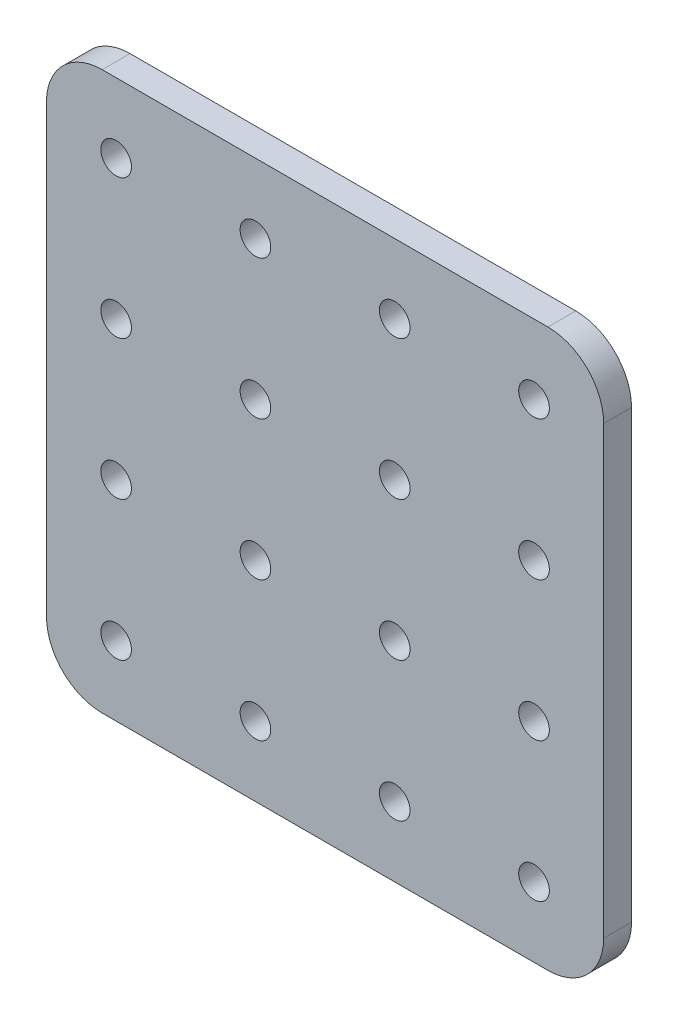
ISO-10303-21;
HEADER;
FILE_DESCRIPTION(('STEP AP214'),'2;1');
FILE_NAME('part.step','',(''),(''),'','','');
FILE_SCHEMA(('AUTOMOTIVE_DESIGN { 1 0 10303 214 1 1 1 1 }'));
ENDSEC;
DATA;
#1=APPLICATION_CONTEXT('core data for automotive mechanical design processes');
#2=APPLICATION_PROTOCOL_DEFINITION('international standard','automotive_design',2000,#1);
#3=PRODUCT_CONTEXT('',#1,'mechanical');
#4=PRODUCT('Part','Part','',(#3));
#5=PRODUCT_RELATED_PRODUCT_CATEGORY('part','',(#4));
#6=PRODUCT_DEFINITION_FORMATION('','',#4);
#7=PRODUCT_DEFINITION_CONTEXT('part definition',#1,'design');
#8=PRODUCT_DEFINITION('design','',#6,#7);
#9=PRODUCT_DEFINITION_SHAPE('','',#8);
#10=(LENGTH_UNIT() NAMED_UNIT(*) SI_UNIT(.MILLI.,.METRE.));
#11=(NAMED_UNIT(*) PLANE_ANGLE_UNIT() SI_UNIT($,.RADIAN.));
#12=(NAMED_UNIT(*) SI_UNIT($,.STERADIAN.) SOLID_ANGLE_UNIT());
#13=UNCERTAINTY_MEASURE_WITH_UNIT(LENGTH_MEASURE(1.E-05),#10,'distance_accuracy_value','');
#14=(GEOMETRIC_REPRESENTATION_CONTEXT(3) GLOBAL_UNCERTAINTY_ASSIGNED_CONTEXT((#13)) GLOBAL_UNIT_ASSIGNED_CONTEXT((#10,
#11,#12)) REPRESENTATION_CONTEXT('',''));
#15=CARTESIAN_POINT('',(0.,0.,0.));
#16=DIRECTION('',(0.,0.,1.));
#17=DIRECTION('',(1.,0.,0.));
#18=AXIS2_PLACEMENT_3D('',#15,#16,#17);
#19=CARTESIAN_POINT('',(0.,0.,2.54));
#20=DIRECTION('',(0.,0.,1.));
#21=DIRECTION('',(1.,0.,0.));
#22=AXIS2_PLACEMENT_3D('',#19,#20,#21);
#23=PLANE('',#22);
#24=CARTESIAN_POINT('',(2.66050878019847E-13,-25.4,2.54));
#25=DIRECTION('',(0.,0.,1.));
#26=DIRECTION('',(1.,0.,0.));
#27=AXIS2_PLACEMENT_3D('',#24,#25,#26);
#28=CIRCLE('',#27,1.397);
#29=CARTESIAN_POINT('',(1.39700000000027,-25.4,2.54));
#30=VERTEX_POINT('',#29);
#31=EDGE_CURVE('E258',#30,#30,#28,.T.);
#32=ORIENTED_EDGE('',*,*,#31,.F.);
#33=EDGE_LOOP('',(#32));
#34=FACE_BOUND('',#33,.T.);
#35=CARTESIAN_POINT('',(38.1000000000004,-38.1,2.54));
#36=DIRECTION('',(0.,0.,1.));
#37=DIRECTION('',(1.,0.,0.));
#38=AXIS2_PLACEMENT_3D('',#35,#36,#37);
#39=CIRCLE('',#38,1.39700000000001);
#40=CARTESIAN_POINT('',(39.4970000000004,-38.1,2.54));
#41=VERTEX_POINT('',#40);
#42=EDGE_CURVE('E246',#41,#41,#39,.T.);
#43=ORIENTED_EDGE('',*,*,#42,.F.);
#44=EDGE_LOOP('',(#43));
#45=FACE_BOUND('',#44,.T.);
#46=CARTESIAN_POINT('',(12.7000000000004,-38.1,2.54));
#47=DIRECTION('',(0.,0.,1.));
#48=DIRECTION('',(1.,0.,0.));
#49=AXIS2_PLACEMENT_3D('',#46,#47,#48);
#50=CIRCLE('',#49,1.397);
#51=CARTESIAN_POINT('',(14.0970000000004,-38.1,2.54));
#52=VERTEX_POINT('',#51);
#53=EDGE_CURVE('E234',#52,#52,#50,.T.);
#54=ORIENTED_EDGE('',*,*,#53,.F.);
#55=EDGE_LOOP('',(#54));
#56=FACE_BOUND('',#55,.T.);
#57=CARTESIAN_POINT('',(25.4000000000003,-25.4,2.54));
#58=DIRECTION('',(0.,0.,1.));
#59=DIRECTION('',(1.,0.,0.));
#60=AXIS2_PLACEMENT_3D('',#57,#58,#59);
#61=CIRCLE('',#60,1.397);
#62=CARTESIAN_POINT('',(26.7970000000003,-25.4,2.54));
#63=VERTEX_POINT('',#62);
#64=EDGE_CURVE('E222',#63,#63,#61,.T.);
#65=ORIENTED_EDGE('',*,*,#64,.F.);
#66=EDGE_LOOP('',(#65));
#67=FACE_BOUND('',#66,.T.);
#68=CARTESIAN_POINT('',(38.1000000000001,-12.7,2.54));
#69=DIRECTION('',(0.,0.,1.));
#70=DIRECTION('',(1.,0.,0.));
#71=AXIS2_PLACEMENT_3D('',#68,#69,#70);
#72=CIRCLE('',#71,1.397);
#73=CARTESIAN_POINT('',(39.4970000000001,-12.7,2.54));
#74=VERTEX_POINT('',#73);
#75=EDGE_CURVE('E210',#74,#74,#72,.T.);
#76=ORIENTED_EDGE('',*,*,#75,.F.);
#77=EDGE_LOOP('',(#76));
#78=FACE_BOUND('',#77,.T.);
#79=CARTESIAN_POINT('',(12.7000000000001,-12.7,2.54));
#80=DIRECTION('',(0.,0.,1.));
#81=DIRECTION('',(1.,0.,0.));
#82=AXIS2_PLACEMENT_3D('',#79,#80,#81);
#83=CIRCLE('',#82,1.397);
#84=CARTESIAN_POINT('',(14.0970000000001,-12.7,2.54));
#85=VERTEX_POINT('',#84);
#86=EDGE_CURVE('E198',#85,#85,#83,.T.);
#87=ORIENTED_EDGE('',*,*,#86,.F.);
#88=EDGE_LOOP('',(#87));
#89=FACE_BOUND('',#88,.T.);
#90=CARTESIAN_POINT('',(25.4,0.,2.54));
#91=DIRECTION('',(0.,0.,1.));
#92=DIRECTION('',(1.,0.,0.));
#93=AXIS2_PLACEMENT_3D('',#90,#91,#92);
#94=CIRCLE('',#93,1.397);
#95=CARTESIAN_POINT('',(26.797,0.,2.54));
#96=VERTEX_POINT('',#95);
#97=EDGE_CURVE('E186',#96,#96,#94,.T.);
#98=ORIENTED_EDGE('',*,*,#97,.F.);
#99=EDGE_LOOP('',(#98));
#100=FACE_BOUND('',#99,.T.);
#101=CARTESIAN_POINT('',(0.,0.,2.54));
#102=DIRECTION('',(0.,0.,1.));
#103=DIRECTION('',(1.,0.,0.));
#104=AXIS2_PLACEMENT_3D('',#101,#102,#103);
#105=CIRCLE('',#104,1.397);
#106=CARTESIAN_POINT('',(1.397,0.,2.54));
#107=VERTEX_POINT('',#106);
#108=EDGE_CURVE('E132',#107,#107,#105,.T.);
#109=ORIENTED_EDGE('',*,*,#108,.F.);
#110=EDGE_LOOP('',(#109));
#111=FACE_BOUND('',#110,.T.);
#112=DIRECTION('',(0.,-1.,0.));
#113=VECTOR('',#112,1.);
#114=CARTESIAN_POINT('',(-6.35,6.35,2.54));
#115=LINE('',#114,#113);
#116=CARTESIAN_POINT('',(-6.35,1.27,2.54));
#117=VERTEX_POINT('',#116);
#118=CARTESIAN_POINT('',(-6.35,-39.37,2.54));
#119=VERTEX_POINT('',#118);
#120=EDGE_CURVE('E137',#117,#119,#115,.T.);
#121=ORIENTED_EDGE('',*,*,#120,.T.);
#122=CARTESIAN_POINT('',(-1.27,-39.37,2.54));
#123=DIRECTION('',(0.,0.,1.));
#124=DIRECTION('',(1.,0.,0.));
#125=AXIS2_PLACEMENT_3D('',#122,#123,#124);
#126=CIRCLE('',#125,5.08);
#127=CARTESIAN_POINT('',(-1.27,-44.45,2.54));
#128=VERTEX_POINT('',#127);
#129=EDGE_CURVE('E152',#119,#128,#126,.T.);
#130=ORIENTED_EDGE('',*,*,#129,.T.);
#131=DIRECTION('',(1.,0.,0.));
#132=VECTOR('',#131,1.);
#133=CARTESIAN_POINT('',(-6.34999999999999,-44.45,2.54));
#134=LINE('',#133,#132);
#135=CARTESIAN_POINT('',(39.37,-44.45,2.54));
#136=VERTEX_POINT('',#135);
#137=EDGE_CURVE('E119',#128,#136,#134,.T.);
#138=ORIENTED_EDGE('',*,*,#137,.T.);
#139=CARTESIAN_POINT('',(39.37,-39.37,2.54));
#140=DIRECTION('',(0.,0.,1.));
#141=DIRECTION('',(1.,0.,0.));
#142=AXIS2_PLACEMENT_3D('',#139,#140,#141);
#143=CIRCLE('',#142,5.08);
#144=CARTESIAN_POINT('',(44.45,-39.37,2.54));
#145=VERTEX_POINT('',#144);
#146=EDGE_CURVE('E150',#136,#145,#143,.T.);
#147=ORIENTED_EDGE('',*,*,#146,.T.);
#148=DIRECTION('',(0.,1.,0.));
#149=VECTOR('',#148,1.);
#150=CARTESIAN_POINT('',(44.45,6.35,2.54));
#151=LINE('',#150,#149);
#152=CARTESIAN_POINT('',(44.45,1.27,2.54));
#153=VERTEX_POINT('',#152);
#154=EDGE_CURVE('E163',#145,#153,#151,.T.);
#155=ORIENTED_EDGE('',*,*,#154,.T.);
#156=CARTESIAN_POINT('',(39.37,1.27,2.54));
#157=DIRECTION('',(0.,0.,1.));
#158=DIRECTION('',(1.,0.,0.));
#159=AXIS2_PLACEMENT_3D('',#156,#157,#158);
#160=CIRCLE('',#159,5.08);
#161=CARTESIAN_POINT('',(39.37,6.35,2.54));
#162=VERTEX_POINT('',#161);
#163=EDGE_CURVE('E54',#153,#162,#160,.T.);
#164=ORIENTED_EDGE('',*,*,#163,.T.);
#165=DIRECTION('',(-1.,0.,0.));
#166=VECTOR('',#165,1.);
#167=CARTESIAN_POINT('',(-6.35,6.35,2.54));
#168=LINE('',#167,#166);
#169=CARTESIAN_POINT('',(-1.27,6.35,2.54));
#170=VERTEX_POINT('',#169);
#171=EDGE_CURVE('E138',#162,#170,#168,.T.);
#172=ORIENTED_EDGE('',*,*,#171,.T.);
#173=CARTESIAN_POINT('',(-1.27,1.27,2.54));
#174=DIRECTION('',(0.,0.,1.));
#175=DIRECTION('',(1.,0.,0.));
#176=AXIS2_PLACEMENT_3D('',#173,#174,#175);
#177=CIRCLE('',#176,5.08);
#178=EDGE_CURVE('E147',#170,#117,#177,.T.);
#179=ORIENTED_EDGE('',*,*,#178,.T.);
#180=EDGE_LOOP('',(#121,#130,#138,#147,#155,#164,#172,#179));
#181=FACE_BOUND('',#180,.T.);
#182=CARTESIAN_POINT('',(12.7,0.,2.54));
#183=DIRECTION('',(0.,0.,1.));
#184=DIRECTION('',(1.,0.,0.));
#185=AXIS2_PLACEMENT_3D('',#182,#183,#184);
#186=CIRCLE('',#185,1.397);
#187=CARTESIAN_POINT('',(14.097,0.,2.54));
#188=VERTEX_POINT('',#187);
#189=EDGE_CURVE('E180',#188,#188,#186,.T.);
#190=ORIENTED_EDGE('',*,*,#189,.F.);
#191=EDGE_LOOP('',(#190));
#192=FACE_BOUND('',#191,.T.);
#193=CARTESIAN_POINT('',(38.1,0.,2.54));
#194=DIRECTION('',(0.,0.,1.));
#195=DIRECTION('',(1.,0.,0.));
#196=AXIS2_PLACEMENT_3D('',#193,#194,#195);
#197=CIRCLE('',#196,1.39700000000001);
#198=CARTESIAN_POINT('',(39.497,0.,2.54));
#199=VERTEX_POINT('',#198);
#200=EDGE_CURVE('E192',#199,#199,#197,.T.);
#201=ORIENTED_EDGE('',*,*,#200,.F.);
#202=EDGE_LOOP('',(#201));
#203=FACE_BOUND('',#202,.T.);
#204=CARTESIAN_POINT('',(25.4000000000001,-12.7,2.54));
#205=DIRECTION('',(0.,0.,1.));
#206=DIRECTION('',(1.,0.,0.));
#207=AXIS2_PLACEMENT_3D('',#204,#205,#206);
#208=CIRCLE('',#207,1.397);
#209=CARTESIAN_POINT('',(26.7970000000001,-12.7,2.54));
#210=VERTEX_POINT('',#209);
#211=EDGE_CURVE('E204',#210,#210,#208,.T.);
#212=ORIENTED_EDGE('',*,*,#211,.F.);
#213=EDGE_LOOP('',(#212));
#214=FACE_BOUND('',#213,.T.);
#215=CARTESIAN_POINT('',(12.7000000000003,-25.4,2.54));
#216=DIRECTION('',(0.,0.,1.));
#217=DIRECTION('',(1.,0.,0.));
#218=AXIS2_PLACEMENT_3D('',#215,#216,#217);
#219=CIRCLE('',#218,1.397);
#220=CARTESIAN_POINT('',(14.0970000000003,-25.4,2.54));
#221=VERTEX_POINT('',#220);
#222=EDGE_CURVE('E216',#221,#221,#219,.T.);
#223=ORIENTED_EDGE('',*,*,#222,.F.);
#224=EDGE_LOOP('',(#223));
#225=FACE_BOUND('',#224,.T.);
#226=CARTESIAN_POINT('',(38.1000000000003,-25.4,2.54));
#227=DIRECTION('',(0.,0.,1.));
#228=DIRECTION('',(1.,0.,0.));
#229=AXIS2_PLACEMENT_3D('',#226,#227,#228);
#230=CIRCLE('',#229,1.39700000000001);
#231=CARTESIAN_POINT('',(39.4970000000003,-25.4,2.54));
#232=VERTEX_POINT('',#231);
#233=EDGE_CURVE('E228',#232,#232,#230,.T.);
#234=ORIENTED_EDGE('',*,*,#233,.F.);
#235=EDGE_LOOP('',(#234));
#236=FACE_BOUND('',#235,.T.);
#237=CARTESIAN_POINT('',(25.4000000000004,-38.1,2.54));
#238=DIRECTION('',(0.,0.,1.));
#239=DIRECTION('',(1.,0.,0.));
#240=AXIS2_PLACEMENT_3D('',#237,#238,#239);
#241=CIRCLE('',#240,1.397);
#242=CARTESIAN_POINT('',(26.7970000000004,-38.1,2.54));
#243=VERTEX_POINT('',#242);
#244=EDGE_CURVE('E240',#243,#243,#241,.T.);
#245=ORIENTED_EDGE('',*,*,#244,.F.);
#246=EDGE_LOOP('',(#245));
#247=FACE_BOUND('',#246,.T.);
#248=CARTESIAN_POINT('',(1.33025439009923E-13,-12.7,2.54));
#249=DIRECTION('',(0.,0.,1.));
#250=DIRECTION('',(1.,0.,0.));
#251=AXIS2_PLACEMENT_3D('',#248,#249,#250);
#252=CIRCLE('',#251,1.397);
#253=CARTESIAN_POINT('',(1.39700000000013,-12.7,2.54));
#254=VERTEX_POINT('',#253);
#255=EDGE_CURVE('E252',#254,#254,#252,.T.);
#256=ORIENTED_EDGE('',*,*,#255,.F.);
#257=EDGE_LOOP('',(#256));
#258=FACE_BOUND('',#257,.T.);
#259=CARTESIAN_POINT('',(3.9907631702977E-13,-38.1,2.54));
#260=DIRECTION('',(0.,0.,1.));
#261=DIRECTION('',(1.,0.,0.));
#262=AXIS2_PLACEMENT_3D('',#259,#260,#261);
#263=CIRCLE('',#262,1.397);
#264=CARTESIAN_POINT('',(1.3970000000004,-38.1,2.54));
#265=VERTEX_POINT('',#264);
#266=EDGE_CURVE('E264',#265,#265,#263,.T.);
#267=ORIENTED_EDGE('',*,*,#266,.F.);
#268=EDGE_LOOP('',(#267));
#269=FACE_BOUND('',#268,.T.);
#270=ADVANCED_FACE('F33',(#34,#45,#56,#67,#78,#89,#100,#111,#181,#192,#203,#214,#225,#236,#247,
#258,#269),#23,.T.);
#271=CARTESIAN_POINT('',(0.,0.,0.));
#272=DIRECTION('',(0.,0.,1.));
#273=DIRECTION('',(1.,0.,0.));
#274=AXIS2_PLACEMENT_3D('',#271,#272,#273);
#275=PLANE('',#274);
#276=CARTESIAN_POINT('',(2.66050878019847E-13,-25.4,0.));
#277=DIRECTION('',(0.,0.,1.));
#278=DIRECTION('',(1.,0.,0.));
#279=AXIS2_PLACEMENT_3D('',#276,#277,#278);
#280=CIRCLE('',#279,1.397);
#281=CARTESIAN_POINT('',(1.39700000000027,-25.4,0.));
#282=VERTEX_POINT('',#281);
#283=EDGE_CURVE('E261',#282,#282,#280,.T.);
#284=ORIENTED_EDGE('',*,*,#283,.T.);
#285=EDGE_LOOP('',(#284));
#286=FACE_BOUND('',#285,.T.);
#287=CARTESIAN_POINT('',(38.1000000000004,-38.1,0.));
#288=DIRECTION('',(0.,0.,1.));
#289=DIRECTION('',(1.,0.,0.));
#290=AXIS2_PLACEMENT_3D('',#287,#288,#289);
#291=CIRCLE('',#290,1.39700000000001);
#292=CARTESIAN_POINT('',(39.4970000000004,-38.1,0.));
#293=VERTEX_POINT('',#292);
#294=EDGE_CURVE('E249',#293,#293,#291,.T.);
#295=ORIENTED_EDGE('',*,*,#294,.T.);
#296=EDGE_LOOP('',(#295));
#297=FACE_BOUND('',#296,.T.);
#298=CARTESIAN_POINT('',(12.7000000000004,-38.1,0.));
#299=DIRECTION('',(0.,0.,1.));
#300=DIRECTION('',(1.,0.,0.));
#301=AXIS2_PLACEMENT_3D('',#298,#299,#300);
#302=CIRCLE('',#301,1.397);
#303=CARTESIAN_POINT('',(14.0970000000004,-38.1,0.));
#304=VERTEX_POINT('',#303);
#305=EDGE_CURVE('E237',#304,#304,#302,.T.);
#306=ORIENTED_EDGE('',*,*,#305,.T.);
#307=EDGE_LOOP('',(#306));
#308=FACE_BOUND('',#307,.T.);
#309=CARTESIAN_POINT('',(25.4000000000003,-25.4,0.));
#310=DIRECTION('',(0.,0.,1.));
#311=DIRECTION('',(1.,0.,0.));
#312=AXIS2_PLACEMENT_3D('',#309,#310,#311);
#313=CIRCLE('',#312,1.397);
#314=CARTESIAN_POINT('',(26.7970000000003,-25.4,0.));
#315=VERTEX_POINT('',#314);
#316=EDGE_CURVE('E225',#315,#315,#313,.T.);
#317=ORIENTED_EDGE('',*,*,#316,.T.);
#318=EDGE_LOOP('',(#317));
#319=FACE_BOUND('',#318,.T.);
#320=CARTESIAN_POINT('',(38.1000000000001,-12.7,0.));
#321=DIRECTION('',(0.,0.,1.));
#322=DIRECTION('',(1.,0.,0.));
#323=AXIS2_PLACEMENT_3D('',#320,#321,#322);
#324=CIRCLE('',#323,1.397);
#325=CARTESIAN_POINT('',(39.4970000000001,-12.7,0.));
#326=VERTEX_POINT('',#325);
#327=EDGE_CURVE('E213',#326,#326,#324,.T.);
#328=ORIENTED_EDGE('',*,*,#327,.T.);
#329=EDGE_LOOP('',(#328));
#330=FACE_BOUND('',#329,.T.);
#331=CARTESIAN_POINT('',(12.7000000000001,-12.7,0.));
#332=DIRECTION('',(0.,0.,1.));
#333=DIRECTION('',(1.,0.,0.));
#334=AXIS2_PLACEMENT_3D('',#331,#332,#333);
#335=CIRCLE('',#334,1.397);
#336=CARTESIAN_POINT('',(14.0970000000001,-12.7,0.));
#337=VERTEX_POINT('',#336);
#338=EDGE_CURVE('E201',#337,#337,#335,.T.);
#339=ORIENTED_EDGE('',*,*,#338,.T.);
#340=EDGE_LOOP('',(#339));
#341=FACE_BOUND('',#340,.T.);
#342=CARTESIAN_POINT('',(25.4,0.,0.));
#343=DIRECTION('',(0.,0.,1.));
#344=DIRECTION('',(1.,0.,0.));
#345=AXIS2_PLACEMENT_3D('',#342,#343,#344);
#346=CIRCLE('',#345,1.397);
#347=CARTESIAN_POINT('',(26.797,0.,0.));
#348=VERTEX_POINT('',#347);
#349=EDGE_CURVE('E189',#348,#348,#346,.T.);
#350=ORIENTED_EDGE('',*,*,#349,.T.);
#351=EDGE_LOOP('',(#350));
#352=FACE_BOUND('',#351,.T.);
#353=CARTESIAN_POINT('',(0.,0.,0.));
#354=DIRECTION('',(0.,0.,1.));
#355=DIRECTION('',(1.,0.,0.));
#356=AXIS2_PLACEMENT_3D('',#353,#354,#355);
#357=CIRCLE('',#356,1.397);
#358=CARTESIAN_POINT('',(1.397,0.,0.));
#359=VERTEX_POINT('',#358);
#360=EDGE_CURVE('E177',#359,#359,#357,.T.);
#361=ORIENTED_EDGE('',*,*,#360,.T.);
#362=EDGE_LOOP('',(#361));
#363=FACE_BOUND('',#362,.T.);
#364=DIRECTION('',(1.,0.,0.));
#365=VECTOR('',#364,1.);
#366=CARTESIAN_POINT('',(-6.34999999999999,-44.45,0.));
#367=LINE('',#366,#365);
#368=CARTESIAN_POINT('',(-1.27,-44.45,0.));
#369=VERTEX_POINT('',#368);
#370=CARTESIAN_POINT('',(39.37,-44.45,0.));
#371=VERTEX_POINT('',#370);
#372=EDGE_CURVE('E116',#369,#371,#367,.T.);
#373=ORIENTED_EDGE('',*,*,#372,.F.);
#374=CARTESIAN_POINT('',(-1.27,-39.37,0.));
#375=DIRECTION('',(0.,0.,1.));
#376=DIRECTION('',(1.,0.,0.));
#377=AXIS2_PLACEMENT_3D('',#374,#375,#376);
#378=CIRCLE('',#377,5.08);
#379=CARTESIAN_POINT('',(-6.35,-39.37,0.));
#380=VERTEX_POINT('',#379);
#381=EDGE_CURVE('E99',#369,#380,#378,.F.);
#382=ORIENTED_EDGE('',*,*,#381,.T.);
#383=DIRECTION('',(0.,-1.,0.));
#384=VECTOR('',#383,1.);
#385=CARTESIAN_POINT('',(-6.35,6.35,0.));
#386=LINE('',#385,#384);
#387=CARTESIAN_POINT('',(-6.35,1.27,0.));
#388=VERTEX_POINT('',#387);
#389=EDGE_CURVE('E127',#388,#380,#386,.T.);
#390=ORIENTED_EDGE('',*,*,#389,.F.);
#391=CARTESIAN_POINT('',(-1.27,1.27,0.));
#392=DIRECTION('',(0.,0.,1.));
#393=DIRECTION('',(1.,0.,0.));
#394=AXIS2_PLACEMENT_3D('',#391,#392,#393);
#395=CIRCLE('',#394,5.08);
#396=CARTESIAN_POINT('',(-1.27,6.35,0.));
#397=VERTEX_POINT('',#396);
#398=EDGE_CURVE('E120',#388,#397,#395,.F.);
#399=ORIENTED_EDGE('',*,*,#398,.T.);
#400=DIRECTION('',(-1.,0.,0.));
#401=VECTOR('',#400,1.);
#402=CARTESIAN_POINT('',(-6.35,6.35,0.));
#403=LINE('',#402,#401);
#404=CARTESIAN_POINT('',(39.37,6.35,0.));
#405=VERTEX_POINT('',#404);
#406=EDGE_CURVE('E130',#405,#397,#403,.T.);
#407=ORIENTED_EDGE('',*,*,#406,.F.);
#408=CARTESIAN_POINT('',(39.37,1.27,0.));
#409=DIRECTION('',(0.,0.,1.));
#410=DIRECTION('',(1.,0.,0.));
#411=AXIS2_PLACEMENT_3D('',#408,#409,#410);
#412=CIRCLE('',#411,5.08);
#413=CARTESIAN_POINT('',(44.45,1.27,0.));
#414=VERTEX_POINT('',#413);
#415=EDGE_CURVE('E141',#405,#414,#412,.F.);
#416=ORIENTED_EDGE('',*,*,#415,.T.);
#417=DIRECTION('',(0.,1.,0.));
#418=VECTOR('',#417,1.);
#419=CARTESIAN_POINT('',(44.45,6.35,0.));
#420=LINE('',#419,#418);
#421=CARTESIAN_POINT('',(44.45,-39.37,0.));
#422=VERTEX_POINT('',#421);
#423=EDGE_CURVE('E126',#422,#414,#420,.T.);
#424=ORIENTED_EDGE('',*,*,#423,.F.);
#425=CARTESIAN_POINT('',(39.37,-39.37,0.));
#426=DIRECTION('',(0.,0.,1.));
#427=DIRECTION('',(1.,0.,0.));
#428=AXIS2_PLACEMENT_3D('',#425,#426,#427);
#429=CIRCLE('',#428,5.08);
#430=EDGE_CURVE('E110',#422,#371,#429,.F.);
#431=ORIENTED_EDGE('',*,*,#430,.T.);
#432=EDGE_LOOP('',(#373,#382,#390,#399,#407,#416,#424,#431));
#433=FACE_BOUND('',#432,.T.);
#434=CARTESIAN_POINT('',(12.7,0.,0.));
#435=DIRECTION('',(0.,0.,1.));
#436=DIRECTION('',(1.,0.,0.));
#437=AXIS2_PLACEMENT_3D('',#434,#435,#436);
#438=CIRCLE('',#437,1.397);
#439=CARTESIAN_POINT('',(14.097,0.,0.));
#440=VERTEX_POINT('',#439);
#441=EDGE_CURVE('E183',#440,#440,#438,.T.);
#442=ORIENTED_EDGE('',*,*,#441,.T.);
#443=EDGE_LOOP('',(#442));
#444=FACE_BOUND('',#443,.T.);
#445=CARTESIAN_POINT('',(38.1,0.,0.));
#446=DIRECTION('',(0.,0.,1.));
#447=DIRECTION('',(1.,0.,0.));
#448=AXIS2_PLACEMENT_3D('',#445,#446,#447);
#449=CIRCLE('',#448,1.39700000000001);
#450=CARTESIAN_POINT('',(39.497,0.,0.));
#451=VERTEX_POINT('',#450);
#452=EDGE_CURVE('E195',#451,#451,#449,.T.);
#453=ORIENTED_EDGE('',*,*,#452,.T.);
#454=EDGE_LOOP('',(#453));
#455=FACE_BOUND('',#454,.T.);
#456=CARTESIAN_POINT('',(25.4000000000001,-12.7,0.));
#457=DIRECTION('',(0.,0.,1.));
#458=DIRECTION('',(1.,0.,0.));
#459=AXIS2_PLACEMENT_3D('',#456,#457,#458);
#460=CIRCLE('',#459,1.397);
#461=CARTESIAN_POINT('',(26.7970000000001,-12.7,0.));
#462=VERTEX_POINT('',#461);
#463=EDGE_CURVE('E207',#462,#462,#460,.T.);
#464=ORIENTED_EDGE('',*,*,#463,.T.);
#465=EDGE_LOOP('',(#464));
#466=FACE_BOUND('',#465,.T.);
#467=CARTESIAN_POINT('',(12.7000000000003,-25.4,0.));
#468=DIRECTION('',(0.,0.,1.));
#469=DIRECTION('',(1.,0.,0.));
#470=AXIS2_PLACEMENT_3D('',#467,#468,#469);
#471=CIRCLE('',#470,1.397);
#472=CARTESIAN_POINT('',(14.0970000000003,-25.4,0.));
#473=VERTEX_POINT('',#472);
#474=EDGE_CURVE('E219',#473,#473,#471,.T.);
#475=ORIENTED_EDGE('',*,*,#474,.T.);
#476=EDGE_LOOP('',(#475));
#477=FACE_BOUND('',#476,.T.);
#478=CARTESIAN_POINT('',(38.1000000000003,-25.4,0.));
#479=DIRECTION('',(0.,0.,1.));
#480=DIRECTION('',(1.,0.,0.));
#481=AXIS2_PLACEMENT_3D('',#478,#479,#480);
#482=CIRCLE('',#481,1.39700000000001);
#483=CARTESIAN_POINT('',(39.4970000000003,-25.4,0.));
#484=VERTEX_POINT('',#483);
#485=EDGE_CURVE('E231',#484,#484,#482,.T.);
#486=ORIENTED_EDGE('',*,*,#485,.T.);
#487=EDGE_LOOP('',(#486));
#488=FACE_BOUND('',#487,.T.);
#489=CARTESIAN_POINT('',(25.4000000000004,-38.1,0.));
#490=DIRECTION('',(0.,0.,1.));
#491=DIRECTION('',(1.,0.,0.));
#492=AXIS2_PLACEMENT_3D('',#489,#490,#491);
#493=CIRCLE('',#492,1.397);
#494=CARTESIAN_POINT('',(26.7970000000004,-38.1,0.));
#495=VERTEX_POINT('',#494);
#496=EDGE_CURVE('E243',#495,#495,#493,.T.);
#497=ORIENTED_EDGE('',*,*,#496,.T.);
#498=EDGE_LOOP('',(#497));
#499=FACE_BOUND('',#498,.T.);
#500=CARTESIAN_POINT('',(1.33025439009923E-13,-12.7,0.));
#501=DIRECTION('',(0.,0.,1.));
#502=DIRECTION('',(1.,0.,0.));
#503=AXIS2_PLACEMENT_3D('',#500,#501,#502);
#504=CIRCLE('',#503,1.397);
#505=CARTESIAN_POINT('',(1.39700000000013,-12.7,0.));
#506=VERTEX_POINT('',#505);
#507=EDGE_CURVE('E255',#506,#506,#504,.T.);
#508=ORIENTED_EDGE('',*,*,#507,.T.);
#509=EDGE_LOOP('',(#508));
#510=FACE_BOUND('',#509,.T.);
#511=CARTESIAN_POINT('',(3.9907631702977E-13,-38.1,0.));
#512=DIRECTION('',(0.,0.,1.));
#513=DIRECTION('',(1.,0.,0.));
#514=AXIS2_PLACEMENT_3D('',#511,#512,#513);
#515=CIRCLE('',#514,1.397);
#516=CARTESIAN_POINT('',(1.3970000000004,-38.1,0.));
#517=VERTEX_POINT('',#516);
#518=EDGE_CURVE('E267',#517,#517,#515,.T.);
#519=ORIENTED_EDGE('',*,*,#518,.T.);
#520=EDGE_LOOP('',(#519));
#521=FACE_BOUND('',#520,.T.);
#522=ADVANCED_FACE('F123',(#286,#297,#308,#319,#330,#341,#352,#363,#433,#444,#455,#466,#477,
#488,#499,#510,#521),#275,.F.);
#523=CARTESIAN_POINT('',(-6.35,6.35,2.54));
#524=DIRECTION('',(1.,0.,0.));
#525=DIRECTION('',(0.,1.,0.));
#526=AXIS2_PLACEMENT_3D('',#523,#524,#525);
#527=PLANE('',#526);
#528=ORIENTED_EDGE('',*,*,#389,.T.);
#529=DIRECTION('',(0.,0.,-1.));
#530=VECTOR('',#529,1.);
#531=CARTESIAN_POINT('',(-6.35,-39.37,2.54));
#532=LINE('',#531,#530);
#533=EDGE_CURVE('E104',#380,#119,#532,.F.);
#534=ORIENTED_EDGE('',*,*,#533,.T.);
#535=ORIENTED_EDGE('',*,*,#120,.F.);
#536=DIRECTION('',(0.,0.,-1.));
#537=VECTOR('',#536,1.);
#538=CARTESIAN_POINT('',(-6.35,1.27,2.54));
#539=LINE('',#538,#537);
#540=EDGE_CURVE('E109',#117,#388,#539,.T.);
#541=ORIENTED_EDGE('',*,*,#540,.T.);
#542=EDGE_LOOP('',(#528,#534,#535,#541));
#543=FACE_BOUND('',#542,.T.);
#544=ADVANCED_FACE('F282',(#543),#527,.F.);
#545=CARTESIAN_POINT('',(-6.34999999999999,-44.45,2.54));
#546=DIRECTION('',(0.,1.,0.));
#547=DIRECTION('',(0.,0.,1.));
#548=AXIS2_PLACEMENT_3D('',#545,#546,#547);
#549=PLANE('',#548);
#550=ORIENTED_EDGE('',*,*,#137,.F.);
#551=DIRECTION('',(0.,0.,-1.));
#552=VECTOR('',#551,1.);
#553=CARTESIAN_POINT('',(-1.27,-44.45,2.54));
#554=LINE('',#553,#552);
#555=EDGE_CURVE('E103',#128,#369,#554,.T.);
#556=ORIENTED_EDGE('',*,*,#555,.T.);
#557=ORIENTED_EDGE('',*,*,#372,.T.);
#558=DIRECTION('',(0.,0.,-1.));
#559=VECTOR('',#558,1.);
#560=CARTESIAN_POINT('',(39.37,-44.45,2.54));
#561=LINE('',#560,#559);
#562=EDGE_CURVE('E121',#371,#136,#561,.F.);
#563=ORIENTED_EDGE('',*,*,#562,.T.);
#564=EDGE_LOOP('',(#550,#556,#557,#563));
#565=FACE_BOUND('',#564,.T.);
#566=ADVANCED_FACE('F115',(#565),#549,.F.);
#567=CARTESIAN_POINT('',(44.45,6.35,2.54));
#568=DIRECTION('',(-1.,0.,0.));
#569=DIRECTION('',(0.,-1.,0.));
#570=AXIS2_PLACEMENT_3D('',#567,#568,#569);
#571=PLANE('',#570);
#572=ORIENTED_EDGE('',*,*,#154,.F.);
#573=DIRECTION('',(0.,0.,-1.));
#574=VECTOR('',#573,1.);
#575=CARTESIAN_POINT('',(44.45,-39.37,2.54));
#576=LINE('',#575,#574);
#577=EDGE_CURVE('E156',#145,#422,#576,.T.);
#578=ORIENTED_EDGE('',*,*,#577,.T.);
#579=ORIENTED_EDGE('',*,*,#423,.T.);
#580=DIRECTION('',(0.,0.,-1.));
#581=VECTOR('',#580,1.);
#582=CARTESIAN_POINT('',(44.45,1.27,2.54));
#583=LINE('',#582,#581);
#584=EDGE_CURVE('E154',#414,#153,#583,.F.);
#585=ORIENTED_EDGE('',*,*,#584,.T.);
#586=EDGE_LOOP('',(#572,#578,#579,#585));
#587=FACE_BOUND('',#586,.T.);
#588=ADVANCED_FACE('F161',(#587),#571,.F.);
#589=CARTESIAN_POINT('',(-6.35,6.35,2.54));
#590=DIRECTION('',(0.,-1.,0.));
#591=DIRECTION('',(0.,0.,-1.));
#592=AXIS2_PLACEMENT_3D('',#589,#590,#591);
#593=PLANE('',#592);
#594=ORIENTED_EDGE('',*,*,#171,.F.);
#595=DIRECTION('',(0.,0.,-1.));
#596=VECTOR('',#595,1.);
#597=CARTESIAN_POINT('',(39.37,6.35,2.54));
#598=LINE('',#597,#596);
#599=EDGE_CURVE('E11',#162,#405,#598,.T.);
#600=ORIENTED_EDGE('',*,*,#599,.T.);
#601=ORIENTED_EDGE('',*,*,#406,.T.);
#602=DIRECTION('',(0.,0.,-1.));
#603=VECTOR('',#602,1.);
#604=CARTESIAN_POINT('',(-1.27,6.35,2.54));
#605=LINE('',#604,#603);
#606=EDGE_CURVE('E41',#397,#170,#605,.F.);
#607=ORIENTED_EDGE('',*,*,#606,.T.);
#608=EDGE_LOOP('',(#594,#600,#601,#607));
#609=FACE_BOUND('',#608,.T.);
#610=ADVANCED_FACE('F170',(#609),#593,.F.);
#611=CARTESIAN_POINT('',(0.,0.,2.54));
#612=DIRECTION('',(0.,0.,-1.));
#613=DIRECTION('',(-1.,0.,0.));
#614=AXIS2_PLACEMENT_3D('',#611,#612,#613);
#615=CYLINDRICAL_SURFACE('',#614,1.397);
#616=ORIENTED_EDGE('',*,*,#108,.T.);
#617=EDGE_LOOP('',(#616));
#618=FACE_BOUND('',#617,.T.);
#619=ORIENTED_EDGE('',*,*,#360,.F.);
#620=EDGE_LOOP('',(#619));
#621=FACE_BOUND('',#620,.T.);
#622=ADVANCED_FACE('F288',(#618,#621),#615,.F.);
#623=CARTESIAN_POINT('',(12.7,0.,2.54));
#624=DIRECTION('',(0.,0.,-1.));
#625=DIRECTION('',(-1.,0.,0.));
#626=AXIS2_PLACEMENT_3D('',#623,#624,#625);
#627=CYLINDRICAL_SURFACE('',#626,1.397);
#628=ORIENTED_EDGE('',*,*,#189,.T.);
#629=EDGE_LOOP('',(#628));
#630=FACE_BOUND('',#629,.T.);
#631=ORIENTED_EDGE('',*,*,#441,.F.);
#632=EDGE_LOOP('',(#631));
#633=FACE_BOUND('',#632,.T.);
#634=ADVANCED_FACE('F387',(#630,#633),#627,.F.);
#635=CARTESIAN_POINT('',(25.4,0.,2.54));
#636=DIRECTION('',(0.,0.,-1.));
#637=DIRECTION('',(-1.,0.,0.));
#638=AXIS2_PLACEMENT_3D('',#635,#636,#637);
#639=CYLINDRICAL_SURFACE('',#638,1.397);
#640=ORIENTED_EDGE('',*,*,#97,.T.);
#641=EDGE_LOOP('',(#640));
#642=FACE_BOUND('',#641,.T.);
#643=ORIENTED_EDGE('',*,*,#349,.F.);
#644=EDGE_LOOP('',(#643));
#645=FACE_BOUND('',#644,.T.);
#646=ADVANCED_FACE('F384',(#642,#645),#639,.F.);
#647=CARTESIAN_POINT('',(38.1,0.,2.54));
#648=DIRECTION('',(0.,0.,-1.));
#649=DIRECTION('',(-1.,0.,0.));
#650=AXIS2_PLACEMENT_3D('',#647,#648,#649);
#651=CYLINDRICAL_SURFACE('',#650,1.39700000000001);
#652=ORIENTED_EDGE('',*,*,#200,.T.);
#653=EDGE_LOOP('',(#652));
#654=FACE_BOUND('',#653,.T.);
#655=ORIENTED_EDGE('',*,*,#452,.F.);
#656=EDGE_LOOP('',(#655));
#657=FACE_BOUND('',#656,.T.);
#658=ADVANCED_FACE('F380',(#654,#657),#651,.F.);
#659=CARTESIAN_POINT('',(12.7000000000001,-12.7,2.54));
#660=DIRECTION('',(0.,0.,-1.));
#661=DIRECTION('',(-1.,0.,0.));
#662=AXIS2_PLACEMENT_3D('',#659,#660,#661);
#663=CYLINDRICAL_SURFACE('',#662,1.397);
#664=ORIENTED_EDGE('',*,*,#86,.T.);
#665=EDGE_LOOP('',(#664));
#666=FACE_BOUND('',#665,.T.);
#667=ORIENTED_EDGE('',*,*,#338,.F.);
#668=EDGE_LOOP('',(#667));
#669=FACE_BOUND('',#668,.T.);
#670=ADVANCED_FACE('F376',(#666,#669),#663,.F.);
#671=CARTESIAN_POINT('',(25.4000000000001,-12.7,2.54));
#672=DIRECTION('',(0.,0.,-1.));
#673=DIRECTION('',(-1.,0.,0.));
#674=AXIS2_PLACEMENT_3D('',#671,#672,#673);
#675=CYLINDRICAL_SURFACE('',#674,1.397);
#676=ORIENTED_EDGE('',*,*,#211,.T.);
#677=EDGE_LOOP('',(#676));
#678=FACE_BOUND('',#677,.T.);
#679=ORIENTED_EDGE('',*,*,#463,.F.);
#680=EDGE_LOOP('',(#679));
#681=FACE_BOUND('',#680,.T.);
#682=ADVANCED_FACE('F372',(#678,#681),#675,.F.);
#683=CARTESIAN_POINT('',(38.1000000000001,-12.7,2.54));
#684=DIRECTION('',(0.,0.,-1.));
#685=DIRECTION('',(-1.,0.,0.));
#686=AXIS2_PLACEMENT_3D('',#683,#684,#685);
#687=CYLINDRICAL_SURFACE('',#686,1.397);
#688=ORIENTED_EDGE('',*,*,#75,.T.);
#689=EDGE_LOOP('',(#688));
#690=FACE_BOUND('',#689,.T.);
#691=ORIENTED_EDGE('',*,*,#327,.F.);
#692=EDGE_LOOP('',(#691));
#693=FACE_BOUND('',#692,.T.);
#694=ADVANCED_FACE('F368',(#690,#693),#687,.F.);
#695=CARTESIAN_POINT('',(12.7000000000003,-25.4,2.54));
#696=DIRECTION('',(0.,0.,-1.));
#697=DIRECTION('',(-1.,0.,0.));
#698=AXIS2_PLACEMENT_3D('',#695,#696,#697);
#699=CYLINDRICAL_SURFACE('',#698,1.397);
#700=ORIENTED_EDGE('',*,*,#222,.T.);
#701=EDGE_LOOP('',(#700));
#702=FACE_BOUND('',#701,.T.);
#703=ORIENTED_EDGE('',*,*,#474,.F.);
#704=EDGE_LOOP('',(#703));
#705=FACE_BOUND('',#704,.T.);
#706=ADVANCED_FACE('F364',(#702,#705),#699,.F.);
#707=CARTESIAN_POINT('',(25.4000000000003,-25.4,2.54));
#708=DIRECTION('',(0.,0.,-1.));
#709=DIRECTION('',(-1.,0.,0.));
#710=AXIS2_PLACEMENT_3D('',#707,#708,#709);
#711=CYLINDRICAL_SURFACE('',#710,1.397);
#712=ORIENTED_EDGE('',*,*,#64,.T.);
#713=EDGE_LOOP('',(#712));
#714=FACE_BOUND('',#713,.T.);
#715=ORIENTED_EDGE('',*,*,#316,.F.);
#716=EDGE_LOOP('',(#715));
#717=FACE_BOUND('',#716,.T.);
#718=ADVANCED_FACE('F360',(#714,#717),#711,.F.);
#719=CARTESIAN_POINT('',(38.1000000000003,-25.4,2.54));
#720=DIRECTION('',(0.,0.,-1.));
#721=DIRECTION('',(-1.,0.,0.));
#722=AXIS2_PLACEMENT_3D('',#719,#720,#721);
#723=CYLINDRICAL_SURFACE('',#722,1.39700000000001);
#724=ORIENTED_EDGE('',*,*,#233,.T.);
#725=EDGE_LOOP('',(#724));
#726=FACE_BOUND('',#725,.T.);
#727=ORIENTED_EDGE('',*,*,#485,.F.);
#728=EDGE_LOOP('',(#727));
#729=FACE_BOUND('',#728,.T.);
#730=ADVANCED_FACE('F356',(#726,#729),#723,.F.);
#731=CARTESIAN_POINT('',(12.7000000000004,-38.1,2.54));
#732=DIRECTION('',(0.,0.,-1.));
#733=DIRECTION('',(-1.,0.,0.));
#734=AXIS2_PLACEMENT_3D('',#731,#732,#733);
#735=CYLINDRICAL_SURFACE('',#734,1.397);
#736=ORIENTED_EDGE('',*,*,#53,.T.);
#737=EDGE_LOOP('',(#736));
#738=FACE_BOUND('',#737,.T.);
#739=ORIENTED_EDGE('',*,*,#305,.F.);
#740=EDGE_LOOP('',(#739));
#741=FACE_BOUND('',#740,.T.);
#742=ADVANCED_FACE('F352',(#738,#741),#735,.F.);
#743=CARTESIAN_POINT('',(25.4000000000004,-38.1,2.54));
#744=DIRECTION('',(0.,0.,-1.));
#745=DIRECTION('',(-1.,0.,0.));
#746=AXIS2_PLACEMENT_3D('',#743,#744,#745);
#747=CYLINDRICAL_SURFACE('',#746,1.397);
#748=ORIENTED_EDGE('',*,*,#244,.T.);
#749=EDGE_LOOP('',(#748));
#750=FACE_BOUND('',#749,.T.);
#751=ORIENTED_EDGE('',*,*,#496,.F.);
#752=EDGE_LOOP('',(#751));
#753=FACE_BOUND('',#752,.T.);
#754=ADVANCED_FACE('F348',(#750,#753),#747,.F.);
#755=CARTESIAN_POINT('',(38.1000000000004,-38.1,2.54));
#756=DIRECTION('',(0.,0.,-1.));
#757=DIRECTION('',(-1.,0.,0.));
#758=AXIS2_PLACEMENT_3D('',#755,#756,#757);
#759=CYLINDRICAL_SURFACE('',#758,1.39700000000001);
#760=ORIENTED_EDGE('',*,*,#42,.T.);
#761=EDGE_LOOP('',(#760));
#762=FACE_BOUND('',#761,.T.);
#763=ORIENTED_EDGE('',*,*,#294,.F.);
#764=EDGE_LOOP('',(#763));
#765=FACE_BOUND('',#764,.T.);
#766=ADVANCED_FACE('F332',(#762,#765),#759,.F.);
#767=CARTESIAN_POINT('',(1.33025439009923E-13,-12.7,2.54));
#768=DIRECTION('',(0.,0.,-1.));
#769=DIRECTION('',(-1.,0.,0.));
#770=AXIS2_PLACEMENT_3D('',#767,#768,#769);
#771=CYLINDRICAL_SURFACE('',#770,1.397);
#772=ORIENTED_EDGE('',*,*,#255,.T.);
#773=EDGE_LOOP('',(#772));
#774=FACE_BOUND('',#773,.T.);
#775=ORIENTED_EDGE('',*,*,#507,.F.);
#776=EDGE_LOOP('',(#775));
#777=FACE_BOUND('',#776,.T.);
#778=ADVANCED_FACE('F328',(#774,#777),#771,.F.);
#779=CARTESIAN_POINT('',(2.66050878019847E-13,-25.4,2.54));
#780=DIRECTION('',(0.,0.,-1.));
#781=DIRECTION('',(-1.,0.,0.));
#782=AXIS2_PLACEMENT_3D('',#779,#780,#781);
#783=CYLINDRICAL_SURFACE('',#782,1.397);
#784=ORIENTED_EDGE('',*,*,#31,.T.);
#785=EDGE_LOOP('',(#784));
#786=FACE_BOUND('',#785,.T.);
#787=ORIENTED_EDGE('',*,*,#283,.F.);
#788=EDGE_LOOP('',(#787));
#789=FACE_BOUND('',#788,.T.);
#790=ADVANCED_FACE('F331',(#786,#789),#783,.F.);
#791=CARTESIAN_POINT('',(3.9907631702977E-13,-38.1,2.54));
#792=DIRECTION('',(0.,0.,-1.));
#793=DIRECTION('',(-1.,0.,0.));
#794=AXIS2_PLACEMENT_3D('',#791,#792,#793);
#795=CYLINDRICAL_SURFACE('',#794,1.397);
#796=ORIENTED_EDGE('',*,*,#266,.T.);
#797=EDGE_LOOP('',(#796));
#798=FACE_BOUND('',#797,.T.);
#799=ORIENTED_EDGE('',*,*,#518,.F.);
#800=EDGE_LOOP('',(#799));
#801=FACE_BOUND('',#800,.T.);
#802=ADVANCED_FACE('F273',(#798,#801),#795,.F.);
#803=CARTESIAN_POINT('',(-1.27,-39.37,2.54));
#804=DIRECTION('',(0.,0.,-1.));
#805=DIRECTION('',(-1.,0.,0.));
#806=AXIS2_PLACEMENT_3D('',#803,#804,#805);
#807=CYLINDRICAL_SURFACE('',#806,5.08);
#808=ORIENTED_EDGE('',*,*,#129,.F.);
#809=ORIENTED_EDGE('',*,*,#533,.F.);
#810=ORIENTED_EDGE('',*,*,#381,.F.);
#811=ORIENTED_EDGE('',*,*,#555,.F.);
#812=EDGE_LOOP('',(#808,#809,#810,#811));
#813=FACE_BOUND('',#812,.T.);
#814=ADVANCED_FACE('F102',(#813),#807,.T.);
#815=CARTESIAN_POINT('',(39.37,-39.37,2.54));
#816=DIRECTION('',(0.,0.,-1.));
#817=DIRECTION('',(-1.,0.,0.));
#818=AXIS2_PLACEMENT_3D('',#815,#816,#817);
#819=CYLINDRICAL_SURFACE('',#818,5.08);
#820=ORIENTED_EDGE('',*,*,#146,.F.);
#821=ORIENTED_EDGE('',*,*,#562,.F.);
#822=ORIENTED_EDGE('',*,*,#430,.F.);
#823=ORIENTED_EDGE('',*,*,#577,.F.);
#824=EDGE_LOOP('',(#820,#821,#822,#823));
#825=FACE_BOUND('',#824,.T.);
#826=ADVANCED_FACE('F302',(#825),#819,.T.);
#827=CARTESIAN_POINT('',(39.37,1.27,2.54));
#828=DIRECTION('',(0.,0.,-1.));
#829=DIRECTION('',(-1.,0.,0.));
#830=AXIS2_PLACEMENT_3D('',#827,#828,#829);
#831=CYLINDRICAL_SURFACE('',#830,5.08);
#832=ORIENTED_EDGE('',*,*,#163,.F.);
#833=ORIENTED_EDGE('',*,*,#584,.F.);
#834=ORIENTED_EDGE('',*,*,#415,.F.);
#835=ORIENTED_EDGE('',*,*,#599,.F.);
#836=EDGE_LOOP('',(#832,#833,#834,#835));
#837=FACE_BOUND('',#836,.T.);
#838=ADVANCED_FACE('F169',(#837),#831,.T.);
#839=CARTESIAN_POINT('',(-1.27,1.27,2.54));
#840=DIRECTION('',(0.,0.,-1.));
#841=DIRECTION('',(-1.,0.,0.));
#842=AXIS2_PLACEMENT_3D('',#839,#840,#841);
#843=CYLINDRICAL_SURFACE('',#842,5.08);
#844=ORIENTED_EDGE('',*,*,#178,.F.);
#845=ORIENTED_EDGE('',*,*,#606,.F.);
#846=ORIENTED_EDGE('',*,*,#398,.F.);
#847=ORIENTED_EDGE('',*,*,#540,.F.);
#848=EDGE_LOOP('',(#844,#845,#846,#847));
#849=FACE_BOUND('',#848,.T.);
#850=ADVANCED_FACE('F35',(#849),#843,.T.);
#851=CLOSED_SHELL('',(#270,#522,#544,#566,#588,#610,#622,#634,#646,#658,#670,#682,#694,#706,
#718,#730,#742,#754,#766,#778,#790,#802,#814,#826,#838,#850));
#852=MANIFOLD_SOLID_BREP('B2',#851);
#853=ADVANCED_BREP_SHAPE_REPRESENTATION('',(#18,#852),#14);
#854=SHAPE_DEFINITION_REPRESENTATION(#9,#853);
ENDSEC;
END-ISO-10303-21;
